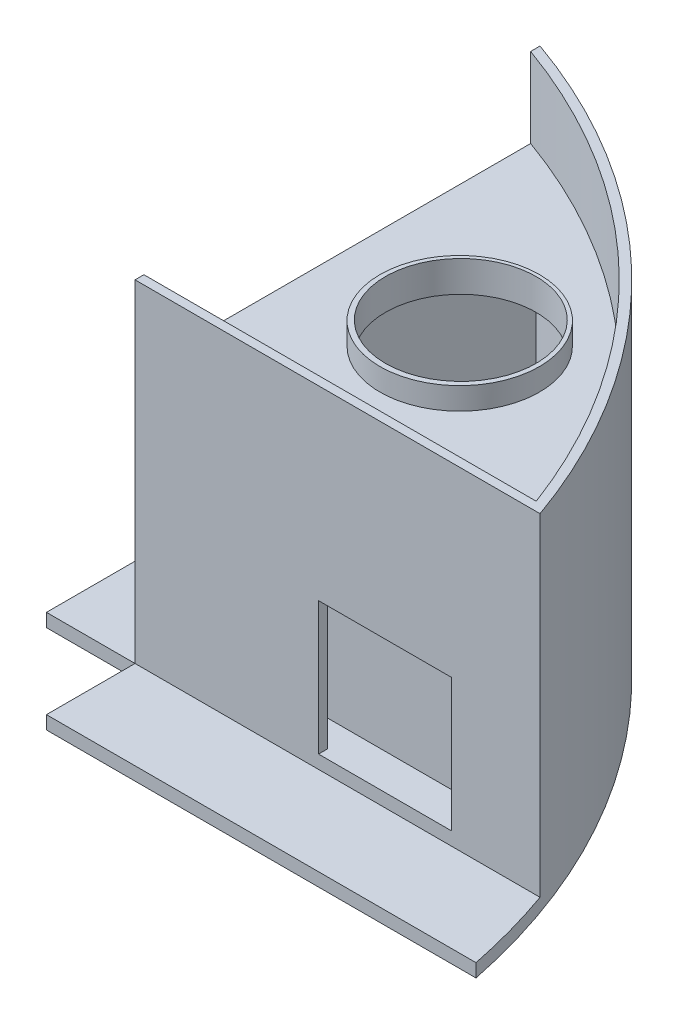
ISO-10303-21;
HEADER;
FILE_DESCRIPTION(('STEP AP214'),'2;1');
FILE_NAME('part.step','',(''),(''),'','','');
FILE_SCHEMA(('AUTOMOTIVE_DESIGN { 1 0 10303 214 1 1 1 1 }'));
ENDSEC;
DATA;
#1=APPLICATION_CONTEXT('core data for automotive mechanical design processes');
#2=APPLICATION_PROTOCOL_DEFINITION('international standard','automotive_design',2000,#1);
#3=PRODUCT_CONTEXT('',#1,'mechanical');
#4=PRODUCT('Part','Part','',(#3));
#5=PRODUCT_RELATED_PRODUCT_CATEGORY('part','',(#4));
#6=PRODUCT_DEFINITION_FORMATION('','',#4);
#7=PRODUCT_DEFINITION_CONTEXT('part definition',#1,'design');
#8=PRODUCT_DEFINITION('design','',#6,#7);
#9=PRODUCT_DEFINITION_SHAPE('','',#8);
#10=(LENGTH_UNIT() NAMED_UNIT(*) SI_UNIT(.MILLI.,.METRE.));
#11=(NAMED_UNIT(*) PLANE_ANGLE_UNIT() SI_UNIT($,.RADIAN.));
#12=(NAMED_UNIT(*) SI_UNIT($,.STERADIAN.) SOLID_ANGLE_UNIT());
#13=UNCERTAINTY_MEASURE_WITH_UNIT(LENGTH_MEASURE(1.E-05),#10,'distance_accuracy_value','');
#14=(GEOMETRIC_REPRESENTATION_CONTEXT(3) GLOBAL_UNCERTAINTY_ASSIGNED_CONTEXT((#13)) GLOBAL_UNIT_ASSIGNED_CONTEXT((#10,
#11,#12)) REPRESENTATION_CONTEXT('',''));
#15=CARTESIAN_POINT('',(0.,0.,0.));
#16=DIRECTION('',(0.,0.,1.));
#17=DIRECTION('',(1.,0.,0.));
#18=AXIS2_PLACEMENT_3D('',#15,#16,#17);
#19=CARTESIAN_POINT('',(-1.66533453693773E-12,58.,1.69309011255336E-12));
#20=DIRECTION('',(0.,-1.,0.));
#21=DIRECTION('',(0.,0.,-1.));
#22=AXIS2_PLACEMENT_3D('',#19,#20,#21);
#23=PLANE('',#22);
#24=CARTESIAN_POINT('',(81.6090308619281,58.,-91.9225229942791));
#25=DIRECTION('',(0.,1.,0.));
#26=DIRECTION('',(0.,0.,1.));
#27=AXIS2_PLACEMENT_3D('',#24,#25,#26);
#28=CIRCLE('',#27,17.);
#29=CARTESIAN_POINT('',(81.6090308619281,58.,-74.9225229942791));
#30=VERTEX_POINT('',#29);
#31=EDGE_CURVE('E379',#30,#30,#28,.T.);
#32=ORIENTED_EDGE('',*,*,#31,.T.);
#33=EDGE_LOOP('',(#32));
#34=FACE_BOUND('',#33,.T.);
#35=DIRECTION('',(-1.,0.,0.));
#36=VECTOR('',#35,1.);
#37=CARTESIAN_POINT('',(-1.66533453693773E-12,58.,-60.0616297668069));
#38=LINE('',#37,#36);
#39=CARTESIAN_POINT('',(135.264927567182,58.,-60.0616297668069));
#40=VERTEX_POINT('',#39);
#41=CARTESIAN_POINT('',(52.,58.,-60.0616297668069));
#42=VERTEX_POINT('',#41);
#43=EDGE_CURVE('E230',#40,#42,#38,.T.);
#44=ORIENTED_EDGE('',*,*,#43,.T.);
#45=DIRECTION('',(0.,0.,-1.));
#46=VECTOR('',#45,1.);
#47=CARTESIAN_POINT('',(52.,58.,1.69757224385444E-12));
#48=LINE('',#47,#46);
#49=CARTESIAN_POINT('',(52.,58.,-138.56406460551));
#50=VERTEX_POINT('',#49);
#51=EDGE_CURVE('E358',#42,#50,#48,.T.);
#52=ORIENTED_EDGE('',*,*,#51,.T.);
#53=CARTESIAN_POINT('',(0.,58.,0.));
#54=DIRECTION('',(0.,-1.,0.));
#55=DIRECTION('',(0.,0.,-1.));
#56=AXIS2_PLACEMENT_3D('',#53,#54,#55);
#57=CIRCLE('',#56,148.);
#58=EDGE_CURVE('E371',#40,#50,#57,.F.);
#59=ORIENTED_EDGE('',*,*,#58,.F.);
#60=EDGE_LOOP('',(#44,#52,#59));
#61=FACE_BOUND('',#60,.T.);
#62=ADVANCED_FACE('F35',(#34,#61),#23,.T.);
#63=CARTESIAN_POINT('',(0.,3.,0.));
#64=DIRECTION('',(0.,-1.,0.));
#65=DIRECTION('',(0.,0.,-1.));
#66=AXIS2_PLACEMENT_3D('',#63,#64,#65);
#67=CYLINDRICAL_SURFACE('',#66,148.);
#68=ORIENTED_EDGE('',*,*,#58,.T.);
#69=DIRECTION('',(0.,-1.,0.));
#70=VECTOR('',#69,1.);
#71=CARTESIAN_POINT('',(52.,60.,-138.56406460551));
#72=LINE('',#71,#70);
#73=CARTESIAN_POINT('',(52.,2.,-138.56406460551));
#74=VERTEX_POINT('',#73);
#75=EDGE_CURVE('E218',#50,#74,#72,.T.);
#76=ORIENTED_EDGE('',*,*,#75,.T.);
#77=CARTESIAN_POINT('',(0.,2.,0.));
#78=DIRECTION('',(0.,1.,0.));
#79=DIRECTION('',(0.,0.,1.));
#80=AXIS2_PLACEMENT_3D('',#77,#78,#79);
#81=CIRCLE('',#80,148.);
#82=CARTESIAN_POINT('',(138.56406460551,2.,-52.));
#83=VERTEX_POINT('',#82);
#84=EDGE_CURVE('E369',#83,#74,#81,.T.);
#85=ORIENTED_EDGE('',*,*,#84,.F.);
#86=DIRECTION('',(0.,-1.,0.));
#87=VECTOR('',#86,1.);
#88=CARTESIAN_POINT('',(138.56406460551,76.,-52.));
#89=LINE('',#88,#87);
#90=CARTESIAN_POINT('',(138.56406460551,4.,-52.));
#91=VERTEX_POINT('',#90);
#92=EDGE_CURVE('E225',#91,#83,#89,.T.);
#93=ORIENTED_EDGE('',*,*,#92,.F.);
#94=CARTESIAN_POINT('',(0.,4.,0.));
#95=DIRECTION('',(0.,-1.,0.));
#96=DIRECTION('',(0.,0.,-1.));
#97=AXIS2_PLACEMENT_3D('',#94,#95,#96);
#98=CIRCLE('',#97,148.);
#99=CARTESIAN_POINT('',(135.264927567182,4.,-60.061629766807));
#100=VERTEX_POINT('',#99);
#101=EDGE_CURVE('E404',#91,#100,#98,.F.);
#102=ORIENTED_EDGE('',*,*,#101,.T.);
#103=DIRECTION('',(0.,-1.,0.));
#104=VECTOR('',#103,1.);
#105=CARTESIAN_POINT('',(135.264927567182,3.,-60.0616297668069));
#106=LINE('',#105,#104);
#107=EDGE_CURVE('E246',#100,#40,#106,.F.);
#108=ORIENTED_EDGE('',*,*,#107,.T.);
#109=EDGE_LOOP('',(#68,#76,#85,#93,#102,#108));
#110=FACE_BOUND('',#109,.T.);
#111=ADVANCED_FACE('F402',(#110),#67,.F.);
#112=CARTESIAN_POINT('',(136.135400057524,60.,-60.0616297668069));
#113=DIRECTION('',(0.,0.,1.));
#114=DIRECTION('',(1.,0.,0.));
#115=AXIS2_PLACEMENT_3D('',#112,#113,#114);
#116=PLANE('',#115);
#117=DIRECTION('',(0.,-1.,0.));
#118=VECTOR('',#117,1.);
#119=CARTESIAN_POINT('',(52.,60.,-60.0616297668069));
#120=LINE('',#119,#118);
#121=CARTESIAN_POINT('',(52.,4.,-60.0616297668069));
#122=VERTEX_POINT('',#121);
#123=EDGE_CURVE('E43',#42,#122,#120,.T.);
#124=ORIENTED_EDGE('',*,*,#123,.F.);
#125=ORIENTED_EDGE('',*,*,#43,.F.);
#126=ORIENTED_EDGE('',*,*,#107,.F.);
#127=DIRECTION('',(-1.,0.,0.));
#128=VECTOR('',#127,1.);
#129=CARTESIAN_POINT('',(88.4846922834953,4.,-60.061629766807));
#130=LINE('',#129,#128);
#131=EDGE_CURVE('E364',#100,#122,#130,.T.);
#132=ORIENTED_EDGE('',*,*,#131,.T.);
#133=EDGE_LOOP('',(#124,#125,#126,#132));
#134=FACE_BOUND('',#133,.T.);
#135=ADVANCED_FACE('F366',(#134),#116,.F.);
#136=CARTESIAN_POINT('',(-1.66533453693773E-12,60.,1.69309011255336E-12));
#137=DIRECTION('',(0.,-1.,0.));
#138=DIRECTION('',(0.,0.,-1.));
#139=AXIS2_PLACEMENT_3D('',#136,#137,#138);
#140=PLANE('',#139);
#141=DIRECTION('',(0.,0.,-1.));
#142=VECTOR('',#141,1.);
#143=CARTESIAN_POINT('',(50.,60.,-58.0616297668069));
#144=LINE('',#143,#142);
#145=CARTESIAN_POINT('',(50.,60.,-58.0616297668069));
#146=VERTEX_POINT('',#145);
#147=CARTESIAN_POINT('',(50.,60.,-139.298241194927));
#148=VERTEX_POINT('',#147);
#149=EDGE_CURVE('E252',#146,#148,#144,.T.);
#150=ORIENTED_EDGE('',*,*,#149,.F.);
#151=DIRECTION('',(-1.,0.,0.));
#152=VECTOR('',#151,1.);
#153=CARTESIAN_POINT('',(136.135400057524,60.,-58.0616297668069));
#154=LINE('',#153,#152);
#155=CARTESIAN_POINT('',(136.135400057524,60.,-58.0616297668069));
#156=VERTEX_POINT('',#155);
#157=EDGE_CURVE('E250',#156,#146,#154,.T.);
#158=ORIENTED_EDGE('',*,*,#157,.F.);
#159=CARTESIAN_POINT('',(-1.66533453693773E-12,60.,1.69309011255336E-12));
#160=DIRECTION('',(0.,-1.,0.));
#161=DIRECTION('',(0.,0.,-1.));
#162=AXIS2_PLACEMENT_3D('',#159,#160,#161);
#163=CIRCLE('',#162,148.000000000002);
#164=EDGE_CURVE('E248',#148,#156,#163,.T.);
#165=ORIENTED_EDGE('',*,*,#164,.F.);
#166=EDGE_LOOP('',(#150,#158,#165));
#167=FACE_BOUND('',#166,.T.);
#168=CARTESIAN_POINT('',(81.6090308619281,60.,-91.6854312211216));
#169=DIRECTION('',(0.,-1.,0.));
#170=DIRECTION('',(0.,0.,-1.));
#171=AXIS2_PLACEMENT_3D('',#168,#169,#170);
#172=CIRCLE('',#171,18.);
#173=CARTESIAN_POINT('',(81.6090308619281,60.,-109.685431221122));
#174=VERTEX_POINT('',#173);
#175=EDGE_CURVE('E351',#174,#174,#172,.F.);
#176=ORIENTED_EDGE('',*,*,#175,.F.);
#177=EDGE_LOOP('',(#176));
#178=FACE_BOUND('',#177,.T.);
#179=ADVANCED_FACE('F415',(#167,#178),#140,.F.);
#180=CARTESIAN_POINT('',(50.,78.,-88.4846922834953));
#181=DIRECTION('',(-1.,0.,0.));
#182=DIRECTION('',(0.,0.,1.));
#183=AXIS2_PLACEMENT_3D('',#180,#181,#182);
#184=PLANE('',#183);
#185=DIRECTION('',(0.,0.,-1.));
#186=VECTOR('',#185,1.);
#187=CARTESIAN_POINT('',(50.,6.,-217.292436663422));
#188=LINE('',#187,#186);
#189=CARTESIAN_POINT('',(50.,6.00000000000001,-52.));
#190=VERTEX_POINT('',#189);
#191=CARTESIAN_POINT('',(50.,6.,-58.061629766807));
#192=VERTEX_POINT('',#191);
#193=EDGE_CURVE('E291',#190,#192,#188,.T.);
#194=ORIENTED_EDGE('',*,*,#193,.T.);
#195=DIRECTION('',(0.,-1.,0.));
#196=VECTOR('',#195,1.);
#197=CARTESIAN_POINT('',(50.,60.,-58.0616297668069));
#198=LINE('',#197,#196);
#199=EDGE_CURVE('E256',#146,#192,#198,.T.);
#200=ORIENTED_EDGE('',*,*,#199,.F.);
#201=ORIENTED_EDGE('',*,*,#149,.T.);
#202=DIRECTION('',(0.,-1.,0.));
#203=VECTOR('',#202,1.);
#204=CARTESIAN_POINT('',(50.,76.,-139.298241194927));
#205=LINE('',#204,#203);
#206=CARTESIAN_POINT('',(50.,78.,-139.298241194927));
#207=VERTEX_POINT('',#206);
#208=EDGE_CURVE('E299',#207,#148,#205,.T.);
#209=ORIENTED_EDGE('',*,*,#208,.F.);
#210=DIRECTION('',(0.,0.,-1.));
#211=VECTOR('',#210,1.);
#212=CARTESIAN_POINT('',(50.,78.,-88.4846922834953));
#213=LINE('',#212,#211);
#214=CARTESIAN_POINT('',(50.,78.,-141.42135623731));
#215=VERTEX_POINT('',#214);
#216=EDGE_CURVE('E314',#207,#215,#213,.T.);
#217=ORIENTED_EDGE('',*,*,#216,.T.);
#218=DIRECTION('',(0.,-1.,0.));
#219=VECTOR('',#218,1.);
#220=CARTESIAN_POINT('',(50.,78.,-141.42135623731));
#221=LINE('',#220,#219);
#222=CARTESIAN_POINT('',(50.,3.,-141.42135623731));
#223=VERTEX_POINT('',#222);
#224=EDGE_CURVE('E319',#215,#223,#221,.T.);
#225=ORIENTED_EDGE('',*,*,#224,.T.);
#226=DIRECTION('',(0.,0.,-1.));
#227=VECTOR('',#226,1.);
#228=CARTESIAN_POINT('',(50.,3.,-88.4846922834953));
#229=LINE('',#228,#227);
#230=CARTESIAN_POINT('',(50.,3.,-58.061629766807));
#231=VERTEX_POINT('',#230);
#232=EDGE_CURVE('E217',#231,#223,#229,.T.);
#233=ORIENTED_EDGE('',*,*,#232,.F.);
#234=DIRECTION('',(0.,-1.,0.));
#235=VECTOR('',#234,1.);
#236=CARTESIAN_POINT('',(50.,60.,-58.061629766807));
#237=LINE('',#236,#235);
#238=CARTESIAN_POINT('',(50.,4.,-58.061629766807));
#239=VERTEX_POINT('',#238);
#240=EDGE_CURVE('E203',#239,#231,#237,.T.);
#241=ORIENTED_EDGE('',*,*,#240,.F.);
#242=DIRECTION('',(0.,0.,-1.));
#243=VECTOR('',#242,1.);
#244=CARTESIAN_POINT('',(50.,4.,-217.292436663422));
#245=LINE('',#244,#243);
#246=CARTESIAN_POINT('',(50.,4.,-52.));
#247=VERTEX_POINT('',#246);
#248=EDGE_CURVE('E215',#247,#239,#245,.T.);
#249=ORIENTED_EDGE('',*,*,#248,.F.);
#250=DIRECTION('',(0.,-1.,0.));
#251=VECTOR('',#250,1.);
#252=CARTESIAN_POINT('',(50.,78.,-52.));
#253=LINE('',#252,#251);
#254=CARTESIAN_POINT('',(50.,3.,-52.));
#255=VERTEX_POINT('',#254);
#256=EDGE_CURVE('E235',#247,#255,#253,.T.);
#257=ORIENTED_EDGE('',*,*,#256,.T.);
#258=CARTESIAN_POINT('',(50.,3.,-50.));
#259=VERTEX_POINT('',#258);
#260=EDGE_CURVE('E329',#259,#255,#229,.T.);
#261=ORIENTED_EDGE('',*,*,#260,.F.);
#262=DIRECTION('',(0.,-1.,0.));
#263=VECTOR('',#262,1.);
#264=CARTESIAN_POINT('',(50.,78.,-50.));
#265=LINE('',#264,#263);
#266=CARTESIAN_POINT('',(50.,78.,-50.));
#267=VERTEX_POINT('',#266);
#268=EDGE_CURVE('E322',#267,#259,#265,.T.);
#269=ORIENTED_EDGE('',*,*,#268,.F.);
#270=CARTESIAN_POINT('',(50.,78.,-52.));
#271=VERTEX_POINT('',#270);
#272=EDGE_CURVE('E310',#267,#271,#213,.T.);
#273=ORIENTED_EDGE('',*,*,#272,.T.);
#274=DIRECTION('',(0.,-1.,0.));
#275=VECTOR('',#274,1.);
#276=CARTESIAN_POINT('',(50.,78.,-52.));
#277=LINE('',#276,#275);
#278=EDGE_CURVE('E303',#271,#190,#277,.T.);
#279=ORIENTED_EDGE('',*,*,#278,.T.);
#280=EDGE_LOOP('',(#194,#200,#201,#209,#217,#225,#233,#241,#249,#257,#261,#269,#273,#279));
#281=FACE_BOUND('',#280,.T.);
#282=ADVANCED_FACE('F213',(#281),#184,.T.);
#283=CARTESIAN_POINT('',(-40.3230520964318,78.,-52.));
#284=DIRECTION('',(0.,0.,-1.));
#285=DIRECTION('',(-1.,0.,0.));
#286=AXIS2_PLACEMENT_3D('',#283,#284,#285);
#287=PLANE('',#286);
#288=DIRECTION('',(1.,0.,0.));
#289=VECTOR('',#288,1.);
#290=CARTESIAN_POINT('',(95.7106781186548,36.,-52.));
#291=LINE('',#290,#289);
#292=CARTESIAN_POINT('',(91.4213562373095,36.,-52.));
#293=VERTEX_POINT('',#292);
#294=CARTESIAN_POINT('',(121.42135623731,36.,-52.));
#295=VERTEX_POINT('',#294);
#296=EDGE_CURVE('E266',#293,#295,#291,.T.);
#297=ORIENTED_EDGE('',*,*,#296,.F.);
#298=DIRECTION('',(0.,1.,0.));
#299=VECTOR('',#298,1.);
#300=CARTESIAN_POINT('',(91.4213562373095,-51.6176843138221,-52.));
#301=LINE('',#300,#299);
#302=CARTESIAN_POINT('',(91.4213562373095,6.,-52.));
#303=VERTEX_POINT('',#302);
#304=EDGE_CURVE('E260',#303,#293,#301,.T.);
#305=ORIENTED_EDGE('',*,*,#304,.F.);
#306=DIRECTION('',(-1.,0.,0.));
#307=VECTOR('',#306,1.);
#308=CARTESIAN_POINT('',(88.4846922834953,6.,-52.));
#309=LINE('',#308,#307);
#310=EDGE_CURVE('E295',#303,#190,#309,.T.);
#311=ORIENTED_EDGE('',*,*,#310,.T.);
#312=ORIENTED_EDGE('',*,*,#278,.F.);
#313=DIRECTION('',(1.,0.,0.));
#314=VECTOR('',#313,1.);
#315=CARTESIAN_POINT('',(50.,78.,-52.));
#316=LINE('',#315,#314);
#317=CARTESIAN_POINT('',(138.56406460551,78.,-52.));
#318=VERTEX_POINT('',#317);
#319=EDGE_CURVE('E288',#271,#318,#316,.T.);
#320=ORIENTED_EDGE('',*,*,#319,.T.);
#321=DIRECTION('',(0.,-1.,0.));
#322=VECTOR('',#321,1.);
#323=CARTESIAN_POINT('',(138.56406460551,76.,-52.));
#324=LINE('',#323,#322);
#325=CARTESIAN_POINT('',(138.56406460551,6.,-52.));
#326=VERTEX_POINT('',#325);
#327=EDGE_CURVE('E300',#318,#326,#324,.T.);
#328=ORIENTED_EDGE('',*,*,#327,.T.);
#329=CARTESIAN_POINT('',(121.42135623731,6.,-52.));
#330=VERTEX_POINT('',#329);
#331=EDGE_CURVE('E296',#326,#330,#309,.T.);
#332=ORIENTED_EDGE('',*,*,#331,.T.);
#333=DIRECTION('',(0.,-1.,0.));
#334=VECTOR('',#333,1.);
#335=CARTESIAN_POINT('',(121.42135623731,-51.6176843138221,-52.));
#336=LINE('',#335,#334);
#337=EDGE_CURVE('E262',#295,#330,#336,.T.);
#338=ORIENTED_EDGE('',*,*,#337,.F.);
#339=EDGE_LOOP('',(#297,#305,#311,#312,#320,#328,#332,#338));
#340=FACE_BOUND('',#339,.T.);
#341=ADVANCED_FACE('F439',(#340),#287,.T.);
#342=CARTESIAN_POINT('',(-40.3230520964318,78.,-50.));
#343=DIRECTION('',(0.,0.,-1.));
#344=DIRECTION('',(-1.,0.,0.));
#345=AXIS2_PLACEMENT_3D('',#342,#343,#344);
#346=PLANE('',#345);
#347=DIRECTION('',(1.,0.,0.));
#348=VECTOR('',#347,1.);
#349=CARTESIAN_POINT('',(-40.3230520964318,3.,-50.));
#350=LINE('',#349,#348);
#351=CARTESIAN_POINT('',(141.42135623731,3.,-50.));
#352=VERTEX_POINT('',#351);
#353=EDGE_CURVE('E325',#259,#352,#350,.T.);
#354=ORIENTED_EDGE('',*,*,#353,.T.);
#355=DIRECTION('',(0.,-1.,0.));
#356=VECTOR('',#355,1.);
#357=CARTESIAN_POINT('',(141.42135623731,78.,-50.));
#358=LINE('',#357,#356);
#359=CARTESIAN_POINT('',(141.42135623731,78.,-50.));
#360=VERTEX_POINT('',#359);
#361=EDGE_CURVE('E333',#360,#352,#358,.T.);
#362=ORIENTED_EDGE('',*,*,#361,.F.);
#363=DIRECTION('',(1.,0.,0.));
#364=VECTOR('',#363,1.);
#365=CARTESIAN_POINT('',(-40.3230520964318,78.,-50.));
#366=LINE('',#365,#364);
#367=EDGE_CURVE('E313',#267,#360,#366,.T.);
#368=ORIENTED_EDGE('',*,*,#367,.F.);
#369=ORIENTED_EDGE('',*,*,#268,.T.);
#370=EDGE_LOOP('',(#354,#362,#368,#369));
#371=FACE_BOUND('',#370,.T.);
#372=DIRECTION('',(0.,1.,0.));
#373=VECTOR('',#372,1.);
#374=CARTESIAN_POINT('',(91.4213562373095,-51.6176843138221,-50.));
#375=LINE('',#374,#373);
#376=CARTESIAN_POINT('',(91.4213562373095,5.99999999999999,-50.));
#377=VERTEX_POINT('',#376);
#378=CARTESIAN_POINT('',(91.4213562373095,36.,-50.));
#379=VERTEX_POINT('',#378);
#380=EDGE_CURVE('E58',#377,#379,#375,.T.);
#381=ORIENTED_EDGE('',*,*,#380,.T.);
#382=DIRECTION('',(1.,0.,0.));
#383=VECTOR('',#382,1.);
#384=CARTESIAN_POINT('',(95.7106781186548,36.,-50.));
#385=LINE('',#384,#383);
#386=CARTESIAN_POINT('',(121.42135623731,36.,-50.));
#387=VERTEX_POINT('',#386);
#388=EDGE_CURVE('E263',#379,#387,#385,.T.);
#389=ORIENTED_EDGE('',*,*,#388,.T.);
#390=DIRECTION('',(0.,-1.,0.));
#391=VECTOR('',#390,1.);
#392=CARTESIAN_POINT('',(121.42135623731,-51.6176843138221,-50.));
#393=LINE('',#392,#391);
#394=CARTESIAN_POINT('',(121.42135623731,6.00000000000001,-50.));
#395=VERTEX_POINT('',#394);
#396=EDGE_CURVE('E273',#387,#395,#393,.T.);
#397=ORIENTED_EDGE('',*,*,#396,.T.);
#398=DIRECTION('',(-1.,0.,0.));
#399=VECTOR('',#398,1.);
#400=CARTESIAN_POINT('',(95.7106781186548,6.,-50.));
#401=LINE('',#400,#399);
#402=EDGE_CURVE('E270',#395,#377,#401,.T.);
#403=ORIENTED_EDGE('',*,*,#402,.T.);
#404=EDGE_LOOP('',(#381,#389,#397,#403));
#405=FACE_BOUND('',#404,.T.);
#406=ADVANCED_FACE('F442',(#371,#405),#346,.F.);
#407=CARTESIAN_POINT('',(0.,3.,0.));
#408=DIRECTION('',(0.,-1.,0.));
#409=DIRECTION('',(0.,0.,-1.));
#410=AXIS2_PLACEMENT_3D('',#407,#408,#409);
#411=CYLINDRICAL_SURFACE('',#410,148.);
#412=DIRECTION('',(0.,-1.,0.));
#413=VECTOR('',#412,1.);
#414=CARTESIAN_POINT('',(136.135400057524,60.,-58.0616297668069));
#415=LINE('',#414,#413);
#416=CARTESIAN_POINT('',(136.135400057524,6.,-58.0616297668069));
#417=VERTEX_POINT('',#416);
#418=EDGE_CURVE('E255',#156,#417,#415,.T.);
#419=ORIENTED_EDGE('',*,*,#418,.T.);
#420=CARTESIAN_POINT('',(-4.30211422042248E-13,6.,3.88578058618805E-13));
#421=DIRECTION('',(0.,-1.,0.));
#422=DIRECTION('',(0.,0.,-1.));
#423=AXIS2_PLACEMENT_3D('',#420,#421,#422);
#424=CIRCLE('',#423,148.000000000001);
#425=EDGE_CURVE('E293',#417,#326,#424,.T.);
#426=ORIENTED_EDGE('',*,*,#425,.T.);
#427=ORIENTED_EDGE('',*,*,#327,.F.);
#428=CARTESIAN_POINT('',(-4.44089209850063E-13,78.,4.30211422042248E-13));
#429=DIRECTION('',(0.,1.,0.));
#430=DIRECTION('',(0.,0.,-1.));
#431=AXIS2_PLACEMENT_3D('',#428,#429,#430);
#432=CIRCLE('',#431,148.000000000001);
#433=EDGE_CURVE('E280',#318,#207,#432,.T.);
#434=ORIENTED_EDGE('',*,*,#433,.T.);
#435=ORIENTED_EDGE('',*,*,#208,.T.);
#436=ORIENTED_EDGE('',*,*,#164,.T.);
#437=EDGE_LOOP('',(#419,#426,#427,#434,#435,#436));
#438=FACE_BOUND('',#437,.T.);
#439=ADVANCED_FACE('F444',(#438),#411,.F.);
#440=CARTESIAN_POINT('',(-40.3230520964318,3.,-88.4846922834953));
#441=DIRECTION('',(0.,1.,0.));
#442=DIRECTION('',(0.,0.,1.));
#443=AXIS2_PLACEMENT_3D('',#440,#441,#442);
#444=PLANE('',#443);
#445=DIRECTION('',(1.,0.,0.));
#446=VECTOR('',#445,1.);
#447=CARTESIAN_POINT('',(-40.3230520964318,3.,-50.));
#448=LINE('',#447,#446);
#449=CARTESIAN_POINT('',(30.,3.,-50.));
#450=VERTEX_POINT('',#449);
#451=EDGE_CURVE('E507',#450,#259,#448,.T.);
#452=ORIENTED_EDGE('',*,*,#451,.T.);
#453=ORIENTED_EDGE('',*,*,#260,.T.);
#454=EDGE_CURVE('E340',#255,#231,#229,.T.);
#455=ORIENTED_EDGE('',*,*,#454,.T.);
#456=ORIENTED_EDGE('',*,*,#232,.T.);
#457=CARTESIAN_POINT('',(0.,3.,0.));
#458=DIRECTION('',(0.,1.,0.));
#459=DIRECTION('',(0.,0.,1.));
#460=AXIS2_PLACEMENT_3D('',#457,#458,#459);
#461=CIRCLE('',#460,150.);
#462=CARTESIAN_POINT('',(30.,3.,-146.969384566991));
#463=VERTEX_POINT('',#462);
#464=EDGE_CURVE('E330',#223,#463,#461,.T.);
#465=ORIENTED_EDGE('',*,*,#464,.T.);
#466=DIRECTION('',(0.,0.,-1.));
#467=VECTOR('',#466,1.);
#468=CARTESIAN_POINT('',(30.,3.,-88.4846922834953));
#469=LINE('',#468,#467);
#470=EDGE_CURVE('E511',#450,#463,#469,.T.);
#471=ORIENTED_EDGE('',*,*,#470,.F.);
#472=EDGE_LOOP('',(#452,#453,#455,#456,#465,#471));
#473=FACE_BOUND('',#472,.T.);
#474=ADVANCED_FACE('F447',(#473),#444,.T.);
#475=CARTESIAN_POINT('',(-40.3230520964318,3.,-50.));
#476=DIRECTION('',(0.,0.,-1.));
#477=DIRECTION('',(-1.,0.,0.));
#478=AXIS2_PLACEMENT_3D('',#475,#476,#477);
#479=PLANE('',#478);
#480=DIRECTION('',(1.,0.,0.));
#481=VECTOR('',#480,1.);
#482=CARTESIAN_POINT('',(-40.3230520964318,0.,-50.));
#483=LINE('',#482,#481);
#484=CARTESIAN_POINT('',(30.,0.,-50.));
#485=VERTEX_POINT('',#484);
#486=CARTESIAN_POINT('',(50.,0.,-50.));
#487=VERTEX_POINT('',#486);
#488=EDGE_CURVE('E495',#485,#487,#483,.T.);
#489=ORIENTED_EDGE('',*,*,#488,.T.);
#490=DIRECTION('',(0.,-1.,0.));
#491=VECTOR('',#490,1.);
#492=CARTESIAN_POINT('',(50.,3.,-50.));
#493=LINE('',#492,#491);
#494=EDGE_CURVE('E490',#259,#487,#493,.T.);
#495=ORIENTED_EDGE('',*,*,#494,.F.);
#496=ORIENTED_EDGE('',*,*,#451,.F.);
#497=DIRECTION('',(0.,-1.,0.));
#498=VECTOR('',#497,1.);
#499=CARTESIAN_POINT('',(30.,3.,-50.));
#500=LINE('',#499,#498);
#501=EDGE_CURVE('E508',#450,#485,#500,.T.);
#502=ORIENTED_EDGE('',*,*,#501,.T.);
#503=EDGE_LOOP('',(#489,#495,#496,#502));
#504=FACE_BOUND('',#503,.T.);
#505=ADVANCED_FACE('F37',(#504),#479,.F.);
#506=CARTESIAN_POINT('',(50.,3.,-88.4846922834953));
#507=DIRECTION('',(-1.,0.,0.));
#508=DIRECTION('',(0.,0.,1.));
#509=AXIS2_PLACEMENT_3D('',#506,#507,#508);
#510=PLANE('',#509);
#511=DIRECTION('',(0.,0.,-1.));
#512=VECTOR('',#511,1.);
#513=CARTESIAN_POINT('',(50.,0.,-88.4846922834953));
#514=LINE('',#513,#512);
#515=CARTESIAN_POINT('',(50.,0.,-30.));
#516=VERTEX_POINT('',#515);
#517=EDGE_CURVE('E485',#516,#487,#514,.T.);
#518=ORIENTED_EDGE('',*,*,#517,.F.);
#519=DIRECTION('',(0.,-1.,0.));
#520=VECTOR('',#519,1.);
#521=CARTESIAN_POINT('',(50.,3.,-30.));
#522=LINE('',#521,#520);
#523=CARTESIAN_POINT('',(50.,3.,-30.));
#524=VERTEX_POINT('',#523);
#525=EDGE_CURVE('E487',#524,#516,#522,.T.);
#526=ORIENTED_EDGE('',*,*,#525,.F.);
#527=DIRECTION('',(0.,0.,-1.));
#528=VECTOR('',#527,1.);
#529=CARTESIAN_POINT('',(50.,3.,-88.4846922834953));
#530=LINE('',#529,#528);
#531=EDGE_CURVE('E535',#524,#259,#530,.T.);
#532=ORIENTED_EDGE('',*,*,#531,.T.);
#533=ORIENTED_EDGE('',*,*,#494,.T.);
#534=EDGE_LOOP('',(#518,#526,#532,#533));
#535=FACE_BOUND('',#534,.T.);
#536=ADVANCED_FACE('F475',(#535),#510,.T.);
#537=CARTESIAN_POINT('',(-40.3230520964318,3.,-30.));
#538=DIRECTION('',(0.,0.,-1.));
#539=DIRECTION('',(-1.,0.,0.));
#540=AXIS2_PLACEMENT_3D('',#537,#538,#539);
#541=PLANE('',#540);
#542=DIRECTION('',(1.,0.,0.));
#543=VECTOR('',#542,1.);
#544=CARTESIAN_POINT('',(-40.3230520964318,0.,-30.));
#545=LINE('',#544,#543);
#546=CARTESIAN_POINT('',(146.969384566991,0.,-30.));
#547=VERTEX_POINT('',#546);
#548=EDGE_CURVE('E494',#516,#547,#545,.T.);
#549=ORIENTED_EDGE('',*,*,#548,.T.);
#550=DIRECTION('',(0.,-1.,0.));
#551=VECTOR('',#550,1.);
#552=CARTESIAN_POINT('',(146.969384566991,3.,-30.));
#553=LINE('',#552,#551);
#554=CARTESIAN_POINT('',(146.969384566991,3.,-30.));
#555=VERTEX_POINT('',#554);
#556=EDGE_CURVE('E513',#555,#547,#553,.T.);
#557=ORIENTED_EDGE('',*,*,#556,.F.);
#558=DIRECTION('',(1.,0.,0.));
#559=VECTOR('',#558,1.);
#560=CARTESIAN_POINT('',(-40.3230520964318,3.,-30.));
#561=LINE('',#560,#559);
#562=EDGE_CURVE('E520',#524,#555,#561,.T.);
#563=ORIENTED_EDGE('',*,*,#562,.F.);
#564=ORIENTED_EDGE('',*,*,#525,.T.);
#565=EDGE_LOOP('',(#549,#557,#563,#564));
#566=FACE_BOUND('',#565,.T.);
#567=ADVANCED_FACE('F472',(#566),#541,.F.);
#568=CARTESIAN_POINT('',(0.,3.,0.));
#569=DIRECTION('',(0.,-1.,0.));
#570=DIRECTION('',(0.,0.,-1.));
#571=AXIS2_PLACEMENT_3D('',#568,#569,#570);
#572=CYLINDRICAL_SURFACE('',#571,150.);
#573=CARTESIAN_POINT('',(0.,0.,0.));
#574=DIRECTION('',(0.,1.,0.));
#575=DIRECTION('',(0.,0.,1.));
#576=AXIS2_PLACEMENT_3D('',#573,#574,#575);
#577=CIRCLE('',#576,150.);
#578=CARTESIAN_POINT('',(30.,0.,-146.969384566991));
#579=VERTEX_POINT('',#578);
#580=EDGE_CURVE('E497',#547,#579,#577,.T.);
#581=ORIENTED_EDGE('',*,*,#580,.T.);
#582=DIRECTION('',(0.,-1.,0.));
#583=VECTOR('',#582,1.);
#584=CARTESIAN_POINT('',(30.,3.,-146.969384566991));
#585=LINE('',#584,#583);
#586=EDGE_CURVE('E510',#463,#579,#585,.T.);
#587=ORIENTED_EDGE('',*,*,#586,.F.);
#588=ORIENTED_EDGE('',*,*,#464,.F.);
#589=ORIENTED_EDGE('',*,*,#224,.F.);
#590=CARTESIAN_POINT('',(0.,78.,0.));
#591=DIRECTION('',(0.,1.,0.));
#592=DIRECTION('',(0.,0.,1.));
#593=AXIS2_PLACEMENT_3D('',#590,#591,#592);
#594=CIRCLE('',#593,150.);
#595=EDGE_CURVE('E316',#360,#215,#594,.T.);
#596=ORIENTED_EDGE('',*,*,#595,.F.);
#597=ORIENTED_EDGE('',*,*,#361,.T.);
#598=EDGE_CURVE('E517',#555,#352,#461,.T.);
#599=ORIENTED_EDGE('',*,*,#598,.F.);
#600=ORIENTED_EDGE('',*,*,#556,.T.);
#601=EDGE_LOOP('',(#581,#587,#588,#589,#596,#597,#599,#600));
#602=FACE_BOUND('',#601,.T.);
#603=ADVANCED_FACE('F468',(#602),#572,.T.);
#604=CARTESIAN_POINT('',(30.,3.,-88.4846922834953));
#605=DIRECTION('',(-1.,0.,0.));
#606=DIRECTION('',(0.,0.,1.));
#607=AXIS2_PLACEMENT_3D('',#604,#605,#606);
#608=PLANE('',#607);
#609=DIRECTION('',(0.,0.,-1.));
#610=VECTOR('',#609,1.);
#611=CARTESIAN_POINT('',(30.,0.,-88.4846922834953));
#612=LINE('',#611,#610);
#613=EDGE_CURVE('E504',#485,#579,#612,.T.);
#614=ORIENTED_EDGE('',*,*,#613,.F.);
#615=ORIENTED_EDGE('',*,*,#501,.F.);
#616=ORIENTED_EDGE('',*,*,#470,.T.);
#617=ORIENTED_EDGE('',*,*,#586,.T.);
#618=EDGE_LOOP('',(#614,#615,#616,#617));
#619=FACE_BOUND('',#618,.T.);
#620=ADVANCED_FACE('F461',(#619),#608,.T.);
#621=ORIENTED_EDGE('',*,*,#353,.F.);
#622=ORIENTED_EDGE('',*,*,#531,.F.);
#623=ORIENTED_EDGE('',*,*,#562,.T.);
#624=ORIENTED_EDGE('',*,*,#598,.T.);
#625=EDGE_LOOP('',(#621,#622,#623,#624));
#626=FACE_BOUND('',#625,.T.);
#627=ADVANCED_FACE('F458',(#626),#444,.T.);
#628=CARTESIAN_POINT('',(-40.3230520964318,0.,-88.4846922834953));
#629=DIRECTION('',(0.,1.,0.));
#630=DIRECTION('',(0.,0.,1.));
#631=AXIS2_PLACEMENT_3D('',#628,#629,#630);
#632=PLANE('',#631);
#633=ORIENTED_EDGE('',*,*,#488,.F.);
#634=ORIENTED_EDGE('',*,*,#613,.T.);
#635=ORIENTED_EDGE('',*,*,#580,.F.);
#636=ORIENTED_EDGE('',*,*,#548,.F.);
#637=ORIENTED_EDGE('',*,*,#517,.T.);
#638=EDGE_LOOP('',(#633,#634,#635,#636,#637));
#639=FACE_BOUND('',#638,.T.);
#640=ADVANCED_FACE('F451',(#639),#632,.F.);
#641=CARTESIAN_POINT('',(-40.3230520964318,78.,-88.4846922834953));
#642=DIRECTION('',(0.,1.,0.));
#643=DIRECTION('',(0.,0.,1.));
#644=AXIS2_PLACEMENT_3D('',#641,#642,#643);
#645=PLANE('',#644);
#646=ORIENTED_EDGE('',*,*,#433,.F.);
#647=ORIENTED_EDGE('',*,*,#319,.F.);
#648=ORIENTED_EDGE('',*,*,#272,.F.);
#649=ORIENTED_EDGE('',*,*,#367,.T.);
#650=ORIENTED_EDGE('',*,*,#595,.T.);
#651=ORIENTED_EDGE('',*,*,#216,.F.);
#652=EDGE_LOOP('',(#646,#647,#648,#649,#650,#651));
#653=FACE_BOUND('',#652,.T.);
#654=ADVANCED_FACE('F438',(#653),#645,.T.);
#655=CARTESIAN_POINT('',(88.4846922834953,6.,-217.292436663422));
#656=DIRECTION('',(0.,-1.,0.));
#657=DIRECTION('',(0.,0.,-1.));
#658=AXIS2_PLACEMENT_3D('',#655,#656,#657);
#659=PLANE('',#658);
#660=ORIENTED_EDGE('',*,*,#425,.F.);
#661=DIRECTION('',(-1.,0.,0.));
#662=VECTOR('',#661,1.);
#663=CARTESIAN_POINT('',(88.4846922834953,6.,-58.061629766807));
#664=LINE('',#663,#662);
#665=EDGE_CURVE('E50',#417,#192,#664,.T.);
#666=ORIENTED_EDGE('',*,*,#665,.T.);
#667=ORIENTED_EDGE('',*,*,#193,.F.);
#668=ORIENTED_EDGE('',*,*,#310,.F.);
#669=DIRECTION('',(0.,0.,1.));
#670=VECTOR('',#669,1.);
#671=CARTESIAN_POINT('',(91.4213562373095,6.,-52.));
#672=LINE('',#671,#670);
#673=EDGE_CURVE('E268',#303,#377,#672,.T.);
#674=ORIENTED_EDGE('',*,*,#673,.T.);
#675=ORIENTED_EDGE('',*,*,#402,.F.);
#676=DIRECTION('',(0.,0.,1.));
#677=VECTOR('',#676,1.);
#678=CARTESIAN_POINT('',(121.42135623731,6.00000000000001,-52.));
#679=LINE('',#678,#677);
#680=EDGE_CURVE('E283',#330,#395,#679,.T.);
#681=ORIENTED_EDGE('',*,*,#680,.F.);
#682=ORIENTED_EDGE('',*,*,#331,.F.);
#683=EDGE_LOOP('',(#660,#666,#667,#668,#674,#675,#681,#682));
#684=FACE_BOUND('',#683,.T.);
#685=ADVANCED_FACE('F435',(#684),#659,.F.);
#686=CARTESIAN_POINT('',(91.4213562373095,-51.6176843138221,-52.));
#687=DIRECTION('',(1.,0.,0.));
#688=DIRECTION('',(0.,0.,-1.));
#689=AXIS2_PLACEMENT_3D('',#686,#687,#688);
#690=PLANE('',#689);
#691=ORIENTED_EDGE('',*,*,#380,.F.);
#692=ORIENTED_EDGE('',*,*,#673,.F.);
#693=ORIENTED_EDGE('',*,*,#304,.T.);
#694=DIRECTION('',(0.,0.,1.));
#695=VECTOR('',#694,1.);
#696=CARTESIAN_POINT('',(91.4213562373095,36.,-52.));
#697=LINE('',#696,#695);
#698=EDGE_CURVE('E278',#293,#379,#697,.T.);
#699=ORIENTED_EDGE('',*,*,#698,.T.);
#700=EDGE_LOOP('',(#691,#692,#693,#699));
#701=FACE_BOUND('',#700,.T.);
#702=ADVANCED_FACE('F428',(#701),#690,.T.);
#703=CARTESIAN_POINT('',(95.7106781186548,36.,-52.));
#704=DIRECTION('',(0.,-1.,0.));
#705=DIRECTION('',(0.,0.,-1.));
#706=AXIS2_PLACEMENT_3D('',#703,#704,#705);
#707=PLANE('',#706);
#708=ORIENTED_EDGE('',*,*,#388,.F.);
#709=ORIENTED_EDGE('',*,*,#698,.F.);
#710=ORIENTED_EDGE('',*,*,#296,.T.);
#711=DIRECTION('',(0.,0.,1.));
#712=VECTOR('',#711,1.);
#713=CARTESIAN_POINT('',(121.42135623731,36.,-52.));
#714=LINE('',#713,#712);
#715=EDGE_CURVE('E281',#295,#387,#714,.T.);
#716=ORIENTED_EDGE('',*,*,#715,.T.);
#717=EDGE_LOOP('',(#708,#709,#710,#716));
#718=FACE_BOUND('',#717,.T.);
#719=ADVANCED_FACE('F425',(#718),#707,.T.);
#720=CARTESIAN_POINT('',(121.42135623731,-51.6176843138221,-52.));
#721=DIRECTION('',(-1.,0.,0.));
#722=DIRECTION('',(0.,0.,1.));
#723=AXIS2_PLACEMENT_3D('',#720,#721,#722);
#724=PLANE('',#723);
#725=ORIENTED_EDGE('',*,*,#396,.F.);
#726=ORIENTED_EDGE('',*,*,#715,.F.);
#727=ORIENTED_EDGE('',*,*,#337,.T.);
#728=ORIENTED_EDGE('',*,*,#680,.T.);
#729=EDGE_LOOP('',(#725,#726,#727,#728));
#730=FACE_BOUND('',#729,.T.);
#731=ADVANCED_FACE('F423',(#730),#724,.T.);
#732=CARTESIAN_POINT('',(136.135400057524,60.,-58.0616297668069));
#733=DIRECTION('',(0.,0.,1.));
#734=DIRECTION('',(1.,0.,0.));
#735=AXIS2_PLACEMENT_3D('',#732,#733,#734);
#736=PLANE('',#735);
#737=ORIENTED_EDGE('',*,*,#199,.T.);
#738=ORIENTED_EDGE('',*,*,#665,.F.);
#739=ORIENTED_EDGE('',*,*,#418,.F.);
#740=ORIENTED_EDGE('',*,*,#157,.T.);
#741=EDGE_LOOP('',(#737,#738,#739,#740));
#742=FACE_BOUND('',#741,.T.);
#743=ADVANCED_FACE('F419',(#742),#736,.T.);
#744=CARTESIAN_POINT('',(50.,78.,-88.4846922834953));
#745=DIRECTION('',(-1.,0.,0.));
#746=DIRECTION('',(0.,0.,1.));
#747=AXIS2_PLACEMENT_3D('',#744,#745,#746);
#748=PLANE('',#747);
#749=DIRECTION('',(0.,0.,-1.));
#750=VECTOR('',#749,1.);
#751=CARTESIAN_POINT('',(50.,2.,-88.4846922834953));
#752=LINE('',#751,#750);
#753=CARTESIAN_POINT('',(50.,2.,-52.));
#754=VERTEX_POINT('',#753);
#755=CARTESIAN_POINT('',(50.,2.,-58.061629766807));
#756=VERTEX_POINT('',#755);
#757=EDGE_CURVE('E240',#754,#756,#752,.T.);
#758=ORIENTED_EDGE('',*,*,#757,.T.);
#759=EDGE_CURVE('E219',#231,#756,#237,.T.);
#760=ORIENTED_EDGE('',*,*,#759,.F.);
#761=ORIENTED_EDGE('',*,*,#454,.F.);
#762=EDGE_CURVE('E228',#255,#754,#253,.T.);
#763=ORIENTED_EDGE('',*,*,#762,.T.);
#764=EDGE_LOOP('',(#758,#760,#761,#763));
#765=FACE_BOUND('',#764,.T.);
#766=ADVANCED_FACE('F422',(#765),#748,.F.);
#767=CARTESIAN_POINT('',(-40.3230520964318,78.,-52.));
#768=DIRECTION('',(0.,0.,-1.));
#769=DIRECTION('',(-1.,0.,0.));
#770=AXIS2_PLACEMENT_3D('',#767,#768,#769);
#771=PLANE('',#770);
#772=DIRECTION('',(1.,0.,0.));
#773=VECTOR('',#772,1.);
#774=CARTESIAN_POINT('',(-40.3230520964318,2.,-52.));
#775=LINE('',#774,#773);
#776=EDGE_CURVE('E237',#754,#83,#775,.T.);
#777=ORIENTED_EDGE('',*,*,#776,.F.);
#778=ORIENTED_EDGE('',*,*,#762,.F.);
#779=ORIENTED_EDGE('',*,*,#256,.F.);
#780=DIRECTION('',(-1.,0.,0.));
#781=VECTOR('',#780,1.);
#782=CARTESIAN_POINT('',(-40.3230520964318,4.,-52.));
#783=LINE('',#782,#781);
#784=EDGE_CURVE('E223',#91,#247,#783,.T.);
#785=ORIENTED_EDGE('',*,*,#784,.F.);
#786=ORIENTED_EDGE('',*,*,#92,.T.);
#787=EDGE_LOOP('',(#777,#778,#779,#785,#786));
#788=FACE_BOUND('',#787,.T.);
#789=ADVANCED_FACE('F547',(#788),#771,.T.);
#790=CARTESIAN_POINT('',(-40.3230520964318,2.,-88.4846922834953));
#791=DIRECTION('',(0.,1.,0.));
#792=DIRECTION('',(0.,0.,1.));
#793=AXIS2_PLACEMENT_3D('',#790,#791,#792);
#794=PLANE('',#793);
#795=DIRECTION('',(1.,0.,0.));
#796=VECTOR('',#795,1.);
#797=CARTESIAN_POINT('',(-40.323052096432,2.,-58.0616297668076));
#798=LINE('',#797,#796);
#799=CARTESIAN_POINT('',(52.,2.,-58.0616297668069));
#800=VERTEX_POINT('',#799);
#801=EDGE_CURVE('E383',#756,#800,#798,.T.);
#802=ORIENTED_EDGE('',*,*,#801,.F.);
#803=ORIENTED_EDGE('',*,*,#757,.F.);
#804=ORIENTED_EDGE('',*,*,#776,.T.);
#805=ORIENTED_EDGE('',*,*,#84,.T.);
#806=DIRECTION('',(0.,0.,1.));
#807=VECTOR('',#806,1.);
#808=CARTESIAN_POINT('',(52.,2.,-88.4846922834953));
#809=LINE('',#808,#807);
#810=EDGE_CURVE('E387',#74,#800,#809,.T.);
#811=ORIENTED_EDGE('',*,*,#810,.T.);
#812=EDGE_LOOP('',(#802,#803,#804,#805,#811));
#813=FACE_BOUND('',#812,.T.);
#814=ADVANCED_FACE('F395',(#813),#794,.T.);
#815=CARTESIAN_POINT('',(88.4846922834953,4.,-217.292436663422));
#816=DIRECTION('',(0.,-1.,0.));
#817=DIRECTION('',(0.,0.,-1.));
#818=AXIS2_PLACEMENT_3D('',#815,#816,#817);
#819=PLANE('',#818);
#820=DIRECTION('',(-1.,0.,0.));
#821=VECTOR('',#820,1.);
#822=CARTESIAN_POINT('',(88.4846922834942,4.,-58.0616297668067));
#823=LINE('',#822,#821);
#824=CARTESIAN_POINT('',(52.,4.,-58.0616297668069));
#825=VERTEX_POINT('',#824);
#826=EDGE_CURVE('E11',#825,#239,#823,.T.);
#827=ORIENTED_EDGE('',*,*,#826,.F.);
#828=DIRECTION('',(0.,0.,-1.));
#829=VECTOR('',#828,1.);
#830=CARTESIAN_POINT('',(52.,4.,-217.292436663422));
#831=LINE('',#830,#829);
#832=EDGE_CURVE('E356',#825,#122,#831,.T.);
#833=ORIENTED_EDGE('',*,*,#832,.T.);
#834=ORIENTED_EDGE('',*,*,#131,.F.);
#835=ORIENTED_EDGE('',*,*,#101,.F.);
#836=ORIENTED_EDGE('',*,*,#784,.T.);
#837=ORIENTED_EDGE('',*,*,#248,.T.);
#838=EDGE_LOOP('',(#827,#833,#834,#835,#836,#837));
#839=FACE_BOUND('',#838,.T.);
#840=ADVANCED_FACE('F221',(#839),#819,.T.);
#841=CARTESIAN_POINT('',(81.6090308619281,65.,-91.6854312211216));
#842=DIRECTION('',(0.,-1.,0.));
#843=DIRECTION('',(0.,0.,-1.));
#844=AXIS2_PLACEMENT_3D('',#841,#842,#843);
#845=CYLINDRICAL_SURFACE('',#844,18.);
#846=CARTESIAN_POINT('',(81.6090308619281,65.,-91.6854312211216));
#847=DIRECTION('',(0.,1.,0.));
#848=DIRECTION('',(0.,0.,1.));
#849=AXIS2_PLACEMENT_3D('',#846,#847,#848);
#850=CIRCLE('',#849,18.);
#851=CARTESIAN_POINT('',(81.6090308619281,65.,-73.6854312211216));
#852=VERTEX_POINT('',#851);
#853=EDGE_CURVE('E376',#852,#852,#850,.T.);
#854=ORIENTED_EDGE('',*,*,#853,.F.);
#855=EDGE_LOOP('',(#854));
#856=FACE_BOUND('',#855,.T.);
#857=ORIENTED_EDGE('',*,*,#175,.T.);
#858=EDGE_LOOP('',(#857));
#859=FACE_BOUND('',#858,.T.);
#860=ADVANCED_FACE('F558',(#856,#859),#845,.T.);
#861=CARTESIAN_POINT('',(81.6090308619281,65.,-91.6854312211216));
#862=DIRECTION('',(0.,1.,0.));
#863=DIRECTION('',(0.,0.,1.));
#864=AXIS2_PLACEMENT_3D('',#861,#862,#863);
#865=PLANE('',#864);
#866=CARTESIAN_POINT('',(81.6090308619281,65.,-91.9225229942791));
#867=DIRECTION('',(0.,1.,0.));
#868=DIRECTION('',(0.,0.,1.));
#869=AXIS2_PLACEMENT_3D('',#866,#867,#868);
#870=CIRCLE('',#869,17.);
#871=CARTESIAN_POINT('',(81.6090308619281,65.,-74.9225229942791));
#872=VERTEX_POINT('',#871);
#873=EDGE_CURVE('E380',#872,#872,#870,.T.);
#874=ORIENTED_EDGE('',*,*,#873,.F.);
#875=EDGE_LOOP('',(#874));
#876=FACE_BOUND('',#875,.T.);
#877=ORIENTED_EDGE('',*,*,#853,.T.);
#878=EDGE_LOOP('',(#877));
#879=FACE_BOUND('',#878,.T.);
#880=ADVANCED_FACE('F562',(#876,#879),#865,.T.);
#881=CARTESIAN_POINT('',(81.6090308619281,58.,-91.9225229942791));
#882=DIRECTION('',(0.,1.,0.));
#883=DIRECTION('',(0.,0.,1.));
#884=AXIS2_PLACEMENT_3D('',#881,#882,#883);
#885=CYLINDRICAL_SURFACE('',#884,17.);
#886=ORIENTED_EDGE('',*,*,#31,.F.);
#887=EDGE_LOOP('',(#886));
#888=FACE_BOUND('',#887,.T.);
#889=ORIENTED_EDGE('',*,*,#873,.T.);
#890=EDGE_LOOP('',(#889));
#891=FACE_BOUND('',#890,.T.);
#892=ADVANCED_FACE('F567',(#888,#891),#885,.F.);
#893=CARTESIAN_POINT('',(52.,60.,-58.0616297668069));
#894=DIRECTION('',(0.,0.,1.));
#895=DIRECTION('',(1.,0.,0.));
#896=AXIS2_PLACEMENT_3D('',#893,#894,#895);
#897=PLANE('',#896);
#898=ORIENTED_EDGE('',*,*,#759,.T.);
#899=ORIENTED_EDGE('',*,*,#801,.T.);
#900=DIRECTION('',(0.,-1.,0.));
#901=VECTOR('',#900,1.);
#902=CARTESIAN_POINT('',(52.,60.,-58.0616297668069));
#903=LINE('',#902,#901);
#904=EDGE_CURVE('E206',#825,#800,#903,.T.);
#905=ORIENTED_EDGE('',*,*,#904,.F.);
#906=ORIENTED_EDGE('',*,*,#826,.T.);
#907=ORIENTED_EDGE('',*,*,#240,.T.);
#908=EDGE_LOOP('',(#898,#899,#905,#906,#907));
#909=FACE_BOUND('',#908,.T.);
#910=ADVANCED_FACE('F202',(#909),#897,.T.);
#911=CARTESIAN_POINT('',(52.,60.,-58.0616297668069));
#912=DIRECTION('',(-1.,0.,0.));
#913=DIRECTION('',(0.,0.,1.));
#914=AXIS2_PLACEMENT_3D('',#911,#912,#913);
#915=PLANE('',#914);
#916=ORIENTED_EDGE('',*,*,#810,.F.);
#917=ORIENTED_EDGE('',*,*,#75,.F.);
#918=ORIENTED_EDGE('',*,*,#51,.F.);
#919=ORIENTED_EDGE('',*,*,#123,.T.);
#920=ORIENTED_EDGE('',*,*,#832,.F.);
#921=ORIENTED_EDGE('',*,*,#904,.T.);
#922=EDGE_LOOP('',(#916,#917,#918,#919,#920,#921));
#923=FACE_BOUND('',#922,.T.);
#924=ADVANCED_FACE('F355',(#923),#915,.F.);
#925=CLOSED_SHELL('',(#62,#111,#135,#179,#282,#341,#406,#439,#474,#505,#536,#567,#603,#620,#627,
#640,#654,#685,#702,#719,#731,#743,#766,#789,#814,#840,#860,#880,#892,#910,#924));
#926=MANIFOLD_SOLID_BREP('B2',#925);
#927=ADVANCED_BREP_SHAPE_REPRESENTATION('',(#18,#926),#14);
#928=SHAPE_DEFINITION_REPRESENTATION(#9,#927);
ENDSEC;
END-ISO-10303-21;
